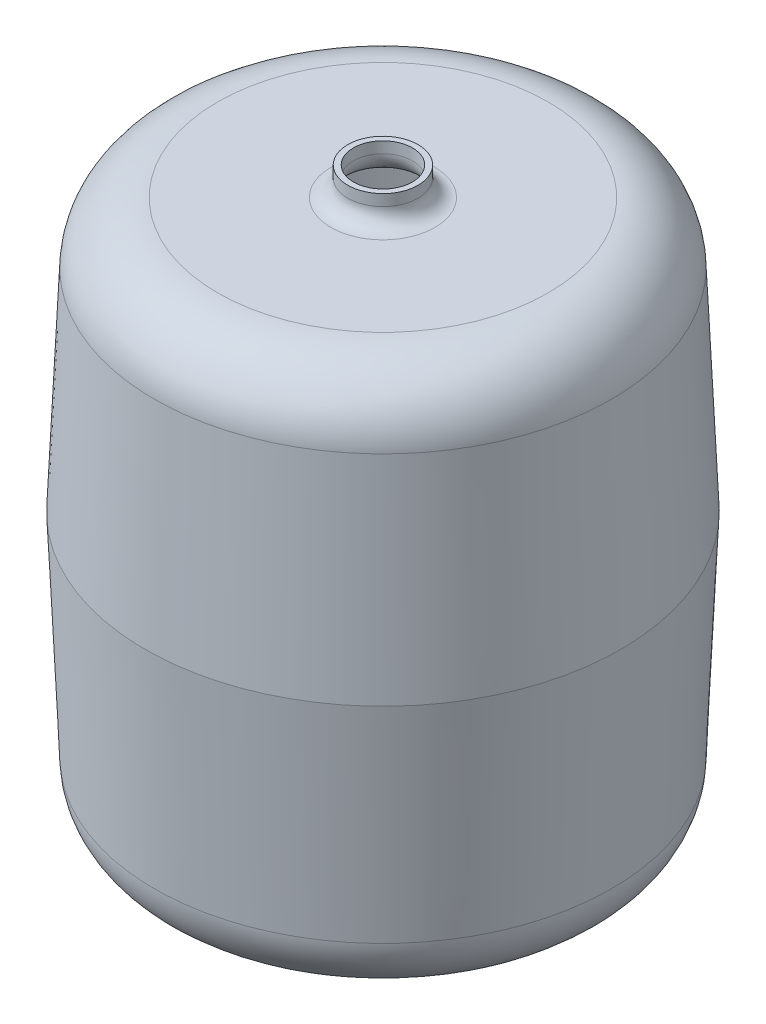
ISO-10303-21;
HEADER;
FILE_DESCRIPTION(('STEP AP214'),'2;1');
FILE_NAME('part.step','',(''),(''),'','','');
FILE_SCHEMA(('AUTOMOTIVE_DESIGN { 1 0 10303 214 1 1 1 1 }'));
ENDSEC;
DATA;
#1=APPLICATION_CONTEXT('core data for automotive mechanical design processes');
#2=APPLICATION_PROTOCOL_DEFINITION('international standard','automotive_design',2000,#1);
#3=PRODUCT_CONTEXT('',#1,'mechanical');
#4=PRODUCT('Part','Part','',(#3));
#5=PRODUCT_RELATED_PRODUCT_CATEGORY('part','',(#4));
#6=PRODUCT_DEFINITION_FORMATION('','',#4);
#7=PRODUCT_DEFINITION_CONTEXT('part definition',#1,'design');
#8=PRODUCT_DEFINITION('design','',#6,#7);
#9=PRODUCT_DEFINITION_SHAPE('','',#8);
#10=(LENGTH_UNIT() NAMED_UNIT(*) SI_UNIT(.MILLI.,.METRE.));
#11=(NAMED_UNIT(*) PLANE_ANGLE_UNIT() SI_UNIT($,.RADIAN.));
#12=(NAMED_UNIT(*) SI_UNIT($,.STERADIAN.) SOLID_ANGLE_UNIT());
#13=UNCERTAINTY_MEASURE_WITH_UNIT(LENGTH_MEASURE(1.E-05),#10,'distance_accuracy_value','');
#14=(GEOMETRIC_REPRESENTATION_CONTEXT(3) GLOBAL_UNCERTAINTY_ASSIGNED_CONTEXT((#13)) GLOBAL_UNIT_ASSIGNED_CONTEXT((#10,
#11,#12)) REPRESENTATION_CONTEXT('',''));
#15=CARTESIAN_POINT('',(0.,0.,0.));
#16=DIRECTION('',(0.,0.,1.));
#17=DIRECTION('',(1.,0.,0.));
#18=AXIS2_PLACEMENT_3D('',#15,#16,#17);
#19=CARTESIAN_POINT('',(0.,-189.75,0.));
#20=DIRECTION('',(0.,-1.,0.));
#21=DIRECTION('',(0.,0.,-1.));
#22=AXIS2_PLACEMENT_3D('',#19,#20,#21);
#23=PLANE('',#22);
#24=CARTESIAN_POINT('',(0.,-189.75,0.));
#25=DIRECTION('',(0.,-1.,0.));
#26=DIRECTION('',(0.,0.,-1.));
#27=AXIS2_PLACEMENT_3D('',#24,#25,#26);
#28=CIRCLE('',#27,117.542830028816);
#29=CARTESIAN_POINT('',(0.,-189.75,-117.542830028816));
#30=VERTEX_POINT('',#29);
#31=EDGE_CURVE('E10',#30,#30,#28,.T.);
#32=ORIENTED_EDGE('',*,*,#31,.F.);
#33=EDGE_LOOP('',(#32));
#34=FACE_BOUND('',#33,.T.);
#35=ADVANCED_FACE('F37',(#34),#23,.F.);
#36=CARTESIAN_POINT('',(0.,-148.75,0.));
#37=DIRECTION('',(0.,-1.,0.));
#38=DIRECTION('',(0.,0.,-1.));
#39=AXIS2_PLACEMENT_3D('',#36,#37,#38);
#40=TOROIDAL_SURFACE('',#39,117.542830028816,41.);
#41=CARTESIAN_POINT('',(0.,-150.538394881979,0.));
#42=DIRECTION('',(0.,-1.,0.));
#43=DIRECTION('',(0.,0.,-1.));
#44=AXIS2_PLACEMENT_3D('',#41,#42,#43);
#45=CIRCLE('',#44,158.503807113673);
#46=CARTESIAN_POINT('',(0.,-150.538394881979,-158.503807113673));
#47=VERTEX_POINT('',#46);
#48=EDGE_CURVE('E43',#47,#47,#45,.T.);
#49=ORIENTED_EDGE('',*,*,#48,.F.);
#50=EDGE_LOOP('',(#49));
#51=FACE_BOUND('',#50,.T.);
#52=ORIENTED_EDGE('',*,*,#31,.T.);
#53=EDGE_LOOP('',(#52));
#54=FACE_BOUND('',#53,.T.);
#55=ADVANCED_FACE('F175',(#51,#54),#40,.F.);
#56=CARTESIAN_POINT('',(0.,-150.538394881979,0.));
#57=DIRECTION('',(0.,1.,0.));
#58=DIRECTION('',(0.,0.,1.));
#59=AXIS2_PLACEMENT_3D('',#56,#57,#58);
#60=CONICAL_SURFACE('',#59,158.503807113673,0.0436332312998548);
#61=CARTESIAN_POINT('',(0.,0.,0.));
#62=DIRECTION('',(0.,-1.,0.));
#63=DIRECTION('',(0.,0.,-1.));
#64=AXIS2_PLACEMENT_3D('',#61,#62,#63);
#65=CIRCLE('',#64,165.076455378153);
#66=CARTESIAN_POINT('',(0.,0.,-165.076455378153));
#67=VERTEX_POINT('',#66);
#68=EDGE_CURVE('E47',#67,#67,#65,.T.);
#69=ORIENTED_EDGE('',*,*,#68,.F.);
#70=EDGE_LOOP('',(#69));
#71=FACE_BOUND('',#70,.T.);
#72=ORIENTED_EDGE('',*,*,#48,.T.);
#73=EDGE_LOOP('',(#72));
#74=FACE_BOUND('',#73,.T.);
#75=ADVANCED_FACE('F170',(#71,#74),#60,.F.);
#76=CARTESIAN_POINT('',(0.,0.,0.));
#77=DIRECTION('',(0.,-1.,0.));
#78=DIRECTION('',(0.,0.,-1.));
#79=AXIS2_PLACEMENT_3D('',#76,#77,#78);
#80=CONICAL_SURFACE('',#79,165.076455378153,0.0436332312998546);
#81=CARTESIAN_POINT('',(0.,150.538394881979,0.));
#82=DIRECTION('',(0.,-1.,0.));
#83=DIRECTION('',(0.,0.,-1.));
#84=AXIS2_PLACEMENT_3D('',#81,#82,#83);
#85=CIRCLE('',#84,158.503807113673);
#86=CARTESIAN_POINT('',(0.,150.538394881979,-158.503807113673));
#87=VERTEX_POINT('',#86);
#88=EDGE_CURVE('E51',#87,#87,#85,.T.);
#89=ORIENTED_EDGE('',*,*,#88,.F.);
#90=EDGE_LOOP('',(#89));
#91=FACE_BOUND('',#90,.T.);
#92=ORIENTED_EDGE('',*,*,#68,.T.);
#93=EDGE_LOOP('',(#92));
#94=FACE_BOUND('',#93,.T.);
#95=ADVANCED_FACE('F164',(#91,#94),#80,.F.);
#96=CARTESIAN_POINT('',(0.,148.75,0.));
#97=DIRECTION('',(0.,-1.,0.));
#98=DIRECTION('',(0.,0.,-1.));
#99=AXIS2_PLACEMENT_3D('',#96,#97,#98);
#100=TOROIDAL_SURFACE('',#99,117.542830028816,41.);
#101=CARTESIAN_POINT('',(0.,189.75,0.));
#102=DIRECTION('',(0.,-1.,0.));
#103=DIRECTION('',(0.,0.,-1.));
#104=AXIS2_PLACEMENT_3D('',#101,#102,#103);
#105=CIRCLE('',#104,117.542830028816);
#106=CARTESIAN_POINT('',(0.,189.75,-117.542830028816));
#107=VERTEX_POINT('',#106);
#108=EDGE_CURVE('E56',#107,#107,#105,.T.);
#109=ORIENTED_EDGE('',*,*,#108,.F.);
#110=EDGE_LOOP('',(#109));
#111=FACE_BOUND('',#110,.T.);
#112=ORIENTED_EDGE('',*,*,#88,.T.);
#113=EDGE_LOOP('',(#112));
#114=FACE_BOUND('',#113,.T.);
#115=ADVANCED_FACE('F158',(#111,#114),#100,.F.);
#116=CARTESIAN_POINT('',(-37.,189.75,0.));
#117=DIRECTION('',(0.,1.,0.));
#118=DIRECTION('',(0.,0.,1.));
#119=AXIS2_PLACEMENT_3D('',#116,#117,#118);
#120=PLANE('',#119);
#121=CARTESIAN_POINT('',(0.,189.75,0.));
#122=DIRECTION('',(0.,-1.,0.));
#123=DIRECTION('',(0.,0.,-1.));
#124=AXIS2_PLACEMENT_3D('',#121,#122,#123);
#125=CIRCLE('',#124,37.);
#126=CARTESIAN_POINT('',(0.,189.75,-37.));
#127=VERTEX_POINT('',#126);
#128=EDGE_CURVE('E59',#127,#127,#125,.T.);
#129=ORIENTED_EDGE('',*,*,#128,.F.);
#130=EDGE_LOOP('',(#129));
#131=FACE_BOUND('',#130,.T.);
#132=ORIENTED_EDGE('',*,*,#108,.T.);
#133=EDGE_LOOP('',(#132));
#134=FACE_BOUND('',#133,.T.);
#135=ADVANCED_FACE('F152',(#131,#134),#120,.F.);
#136=CARTESIAN_POINT('',(0.,205.75,0.));
#137=DIRECTION('',(0.,-1.,0.));
#138=DIRECTION('',(0.,0.,-1.));
#139=AXIS2_PLACEMENT_3D('',#136,#137,#138);
#140=TOROIDAL_SURFACE('',#139,37.,16.);
#141=CARTESIAN_POINT('',(0.,205.75,0.));
#142=DIRECTION('',(0.,-1.,0.));
#143=DIRECTION('',(0.,0.,-1.));
#144=AXIS2_PLACEMENT_3D('',#141,#142,#143);
#145=CIRCLE('',#144,21.);
#146=CARTESIAN_POINT('',(0.,205.75,-21.));
#147=VERTEX_POINT('',#146);
#148=EDGE_CURVE('E62',#147,#147,#145,.T.);
#149=ORIENTED_EDGE('',*,*,#148,.F.);
#150=EDGE_LOOP('',(#149));
#151=FACE_BOUND('',#150,.T.);
#152=ORIENTED_EDGE('',*,*,#128,.T.);
#153=EDGE_LOOP('',(#152));
#154=FACE_BOUND('',#153,.T.);
#155=ADVANCED_FACE('F146',(#151,#154),#140,.T.);
#156=CARTESIAN_POINT('',(0.,0.,0.));
#157=DIRECTION('',(0.,-1.,0.));
#158=DIRECTION('',(0.,0.,-1.));
#159=AXIS2_PLACEMENT_3D('',#156,#157,#158);
#160=CYLINDRICAL_SURFACE('',#159,21.);
#161=CARTESIAN_POINT('',(0.,213.75,0.));
#162=DIRECTION('',(0.,-1.,0.));
#163=DIRECTION('',(0.,0.,-1.));
#164=AXIS2_PLACEMENT_3D('',#161,#162,#163);
#165=CIRCLE('',#164,21.);
#166=CARTESIAN_POINT('',(0.,213.75,-21.));
#167=VERTEX_POINT('',#166);
#168=EDGE_CURVE('E65',#167,#167,#165,.T.);
#169=ORIENTED_EDGE('',*,*,#168,.F.);
#170=EDGE_LOOP('',(#169));
#171=FACE_BOUND('',#170,.T.);
#172=ORIENTED_EDGE('',*,*,#148,.T.);
#173=EDGE_LOOP('',(#172));
#174=FACE_BOUND('',#173,.T.);
#175=ADVANCED_FACE('F140',(#171,#174),#160,.F.);
#176=CARTESIAN_POINT('',(-25.,213.75,0.));
#177=DIRECTION('',(0.,-1.,0.));
#178=DIRECTION('',(0.,0.,-1.));
#179=AXIS2_PLACEMENT_3D('',#176,#177,#178);
#180=PLANE('',#179);
#181=CARTESIAN_POINT('',(0.,213.75,0.));
#182=DIRECTION('',(0.,-1.,0.));
#183=DIRECTION('',(0.,0.,-1.));
#184=AXIS2_PLACEMENT_3D('',#181,#182,#183);
#185=CIRCLE('',#184,25.);
#186=CARTESIAN_POINT('',(0.,213.75,-25.));
#187=VERTEX_POINT('',#186);
#188=EDGE_CURVE('E68',#187,#187,#185,.T.);
#189=ORIENTED_EDGE('',*,*,#188,.F.);
#190=EDGE_LOOP('',(#189));
#191=FACE_BOUND('',#190,.T.);
#192=ORIENTED_EDGE('',*,*,#168,.T.);
#193=EDGE_LOOP('',(#192));
#194=FACE_BOUND('',#193,.T.);
#195=ADVANCED_FACE('F134',(#191,#194),#180,.F.);
#196=CARTESIAN_POINT('',(0.,0.,0.));
#197=DIRECTION('',(0.,-1.,0.));
#198=DIRECTION('',(0.,0.,-1.));
#199=AXIS2_PLACEMENT_3D('',#196,#197,#198);
#200=CYLINDRICAL_SURFACE('',#199,25.);
#201=CARTESIAN_POINT('',(0.,205.75,0.));
#202=DIRECTION('',(0.,-1.,0.));
#203=DIRECTION('',(0.,0.,-1.));
#204=AXIS2_PLACEMENT_3D('',#201,#202,#203);
#205=CIRCLE('',#204,25.);
#206=CARTESIAN_POINT('',(0.,205.75,-25.));
#207=VERTEX_POINT('',#206);
#208=EDGE_CURVE('E71',#207,#207,#205,.T.);
#209=ORIENTED_EDGE('',*,*,#208,.F.);
#210=EDGE_LOOP('',(#209));
#211=FACE_BOUND('',#210,.T.);
#212=ORIENTED_EDGE('',*,*,#188,.T.);
#213=EDGE_LOOP('',(#212));
#214=FACE_BOUND('',#213,.T.);
#215=ADVANCED_FACE('F128',(#211,#214),#200,.T.);
#216=CARTESIAN_POINT('',(0.,205.75,0.));
#217=DIRECTION('',(0.,-1.,0.));
#218=DIRECTION('',(0.,0.,-1.));
#219=AXIS2_PLACEMENT_3D('',#216,#217,#218);
#220=TOROIDAL_SURFACE('',#219,37.,12.);
#221=CARTESIAN_POINT('',(0.,193.75,0.));
#222=DIRECTION('',(0.,-1.,0.));
#223=DIRECTION('',(0.,0.,-1.));
#224=AXIS2_PLACEMENT_3D('',#221,#222,#223);
#225=CIRCLE('',#224,37.);
#226=CARTESIAN_POINT('',(0.,193.75,-37.));
#227=VERTEX_POINT('',#226);
#228=EDGE_CURVE('E74',#227,#227,#225,.T.);
#229=ORIENTED_EDGE('',*,*,#228,.F.);
#230=EDGE_LOOP('',(#229));
#231=FACE_BOUND('',#230,.T.);
#232=ORIENTED_EDGE('',*,*,#208,.T.);
#233=EDGE_LOOP('',(#232));
#234=FACE_BOUND('',#233,.T.);
#235=ADVANCED_FACE('F122',(#231,#234),#220,.F.);
#236=CARTESIAN_POINT('',(-37.,193.75,0.));
#237=DIRECTION('',(0.,-1.,0.));
#238=DIRECTION('',(0.,0.,-1.));
#239=AXIS2_PLACEMENT_3D('',#236,#237,#238);
#240=PLANE('',#239);
#241=CARTESIAN_POINT('',(0.,193.75,0.));
#242=DIRECTION('',(0.,-1.,0.));
#243=DIRECTION('',(0.,0.,-1.));
#244=AXIS2_PLACEMENT_3D('',#241,#242,#243);
#245=CIRCLE('',#244,117.542830028816);
#246=CARTESIAN_POINT('',(0.,193.75,-117.542830028816));
#247=VERTEX_POINT('',#246);
#248=EDGE_CURVE('E77',#247,#247,#245,.T.);
#249=ORIENTED_EDGE('',*,*,#248,.F.);
#250=EDGE_LOOP('',(#249));
#251=FACE_BOUND('',#250,.T.);
#252=ORIENTED_EDGE('',*,*,#228,.T.);
#253=EDGE_LOOP('',(#252));
#254=FACE_BOUND('',#253,.T.);
#255=ADVANCED_FACE('F116',(#251,#254),#240,.F.);
#256=CARTESIAN_POINT('',(0.,148.75,0.));
#257=DIRECTION('',(0.,-1.,0.));
#258=DIRECTION('',(0.,0.,-1.));
#259=AXIS2_PLACEMENT_3D('',#256,#257,#258);
#260=TOROIDAL_SURFACE('',#259,117.542830028816,45.);
#261=CARTESIAN_POINT('',(0.,150.71287243144,0.));
#262=DIRECTION('',(0.,-1.,0.));
#263=DIRECTION('',(0.,0.,-1.));
#264=AXIS2_PLACEMENT_3D('',#261,#262,#263);
#265=CIRCLE('',#264,162.5);
#266=CARTESIAN_POINT('',(0.,150.71287243144,-162.5));
#267=VERTEX_POINT('',#266);
#268=EDGE_CURVE('E80',#267,#267,#265,.T.);
#269=ORIENTED_EDGE('',*,*,#268,.F.);
#270=EDGE_LOOP('',(#269));
#271=FACE_BOUND('',#270,.T.);
#272=ORIENTED_EDGE('',*,*,#248,.T.);
#273=EDGE_LOOP('',(#272));
#274=FACE_BOUND('',#273,.T.);
#275=ADVANCED_FACE('F110',(#271,#274),#260,.T.);
#276=CARTESIAN_POINT('',(0.,150.71287243144,0.));
#277=DIRECTION('',(0.,-1.,0.));
#278=DIRECTION('',(0.,0.,-1.));
#279=AXIS2_PLACEMENT_3D('',#276,#277,#278);
#280=CONICAL_SURFACE('',#279,162.5,0.0436332312998548);
#281=CARTESIAN_POINT('',(0.,0.,0.));
#282=DIRECTION('',(0.,-1.,0.));
#283=DIRECTION('',(0.,0.,-1.));
#284=AXIS2_PLACEMENT_3D('',#281,#282,#283);
#285=CIRCLE('',#284,169.080266118806);
#286=CARTESIAN_POINT('',(0.,0.,-169.080266118806));
#287=VERTEX_POINT('',#286);
#288=EDGE_CURVE('E83',#287,#287,#285,.T.);
#289=ORIENTED_EDGE('',*,*,#288,.F.);
#290=EDGE_LOOP('',(#289));
#291=FACE_BOUND('',#290,.T.);
#292=ORIENTED_EDGE('',*,*,#268,.T.);
#293=EDGE_LOOP('',(#292));
#294=FACE_BOUND('',#293,.T.);
#295=ADVANCED_FACE('F104',(#291,#294),#280,.T.);
#296=CARTESIAN_POINT('',(0.,0.,0.));
#297=DIRECTION('',(0.,1.,0.));
#298=DIRECTION('',(0.,0.,1.));
#299=AXIS2_PLACEMENT_3D('',#296,#297,#298);
#300=CONICAL_SURFACE('',#299,169.080266118806,0.0436332312998548);
#301=CARTESIAN_POINT('',(0.,-150.71287243144,0.));
#302=DIRECTION('',(0.,-1.,0.));
#303=DIRECTION('',(0.,0.,-1.));
#304=AXIS2_PLACEMENT_3D('',#301,#302,#303);
#305=CIRCLE('',#304,162.5);
#306=CARTESIAN_POINT('',(0.,-150.71287243144,-162.5));
#307=VERTEX_POINT('',#306);
#308=EDGE_CURVE('E86',#307,#307,#305,.T.);
#309=ORIENTED_EDGE('',*,*,#308,.F.);
#310=EDGE_LOOP('',(#309));
#311=FACE_BOUND('',#310,.T.);
#312=ORIENTED_EDGE('',*,*,#288,.T.);
#313=EDGE_LOOP('',(#312));
#314=FACE_BOUND('',#313,.T.);
#315=ADVANCED_FACE('F98',(#311,#314),#300,.T.);
#316=CARTESIAN_POINT('',(0.,-148.75,0.));
#317=DIRECTION('',(0.,-1.,0.));
#318=DIRECTION('',(0.,0.,-1.));
#319=AXIS2_PLACEMENT_3D('',#316,#317,#318);
#320=TOROIDAL_SURFACE('',#319,117.542830028816,45.);
#321=CARTESIAN_POINT('',(0.,-193.75,0.));
#322=DIRECTION('',(0.,-1.,0.));
#323=DIRECTION('',(0.,0.,-1.));
#324=AXIS2_PLACEMENT_3D('',#321,#322,#323);
#325=CIRCLE('',#324,117.542830028816);
#326=CARTESIAN_POINT('',(0.,-193.75,-117.542830028816));
#327=VERTEX_POINT('',#326);
#328=EDGE_CURVE('E89',#327,#327,#325,.T.);
#329=ORIENTED_EDGE('',*,*,#328,.F.);
#330=EDGE_LOOP('',(#329));
#331=FACE_BOUND('',#330,.T.);
#332=ORIENTED_EDGE('',*,*,#308,.T.);
#333=EDGE_LOOP('',(#332));
#334=FACE_BOUND('',#333,.T.);
#335=ADVANCED_FACE('F95',(#331,#334),#320,.T.);
#336=CARTESIAN_POINT('',(0.,-193.75,0.));
#337=DIRECTION('',(0.,1.,0.));
#338=DIRECTION('',(0.,0.,1.));
#339=AXIS2_PLACEMENT_3D('',#336,#337,#338);
#340=PLANE('',#339);
#341=ORIENTED_EDGE('',*,*,#328,.T.);
#342=EDGE_LOOP('',(#341));
#343=FACE_BOUND('',#342,.T.);
#344=ADVANCED_FACE('F93',(#343),#340,.F.);
#345=CLOSED_SHELL('',(#35,#55,#75,#95,#115,#135,#155,#175,#195,#215,#235,#255,#275,#295,#315,
#335,#344));
#346=MANIFOLD_SOLID_BREP('B2',#345);
#347=ADVANCED_BREP_SHAPE_REPRESENTATION('',(#18,#346),#14);
#348=SHAPE_DEFINITION_REPRESENTATION(#9,#347);
ENDSEC;
END-ISO-10303-21;
